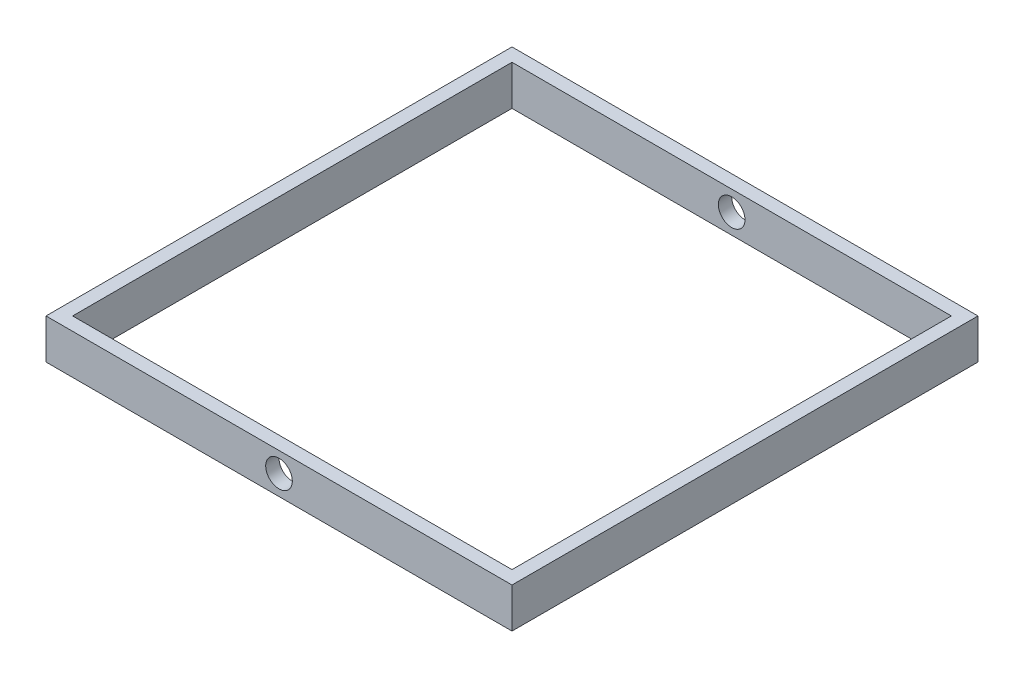
ISO-10303-21;
HEADER;
FILE_DESCRIPTION(('STEP AP214'),'2;1');
FILE_NAME('part.step','',(''),(''),'','','');
FILE_SCHEMA(('AUTOMOTIVE_DESIGN { 1 0 10303 214 1 1 1 1 }'));
ENDSEC;
DATA;
#1=APPLICATION_CONTEXT('core data for automotive mechanical design processes');
#2=APPLICATION_PROTOCOL_DEFINITION('international standard','automotive_design',2000,#1);
#3=PRODUCT_CONTEXT('',#1,'mechanical');
#4=PRODUCT('Part','Part','',(#3));
#5=PRODUCT_RELATED_PRODUCT_CATEGORY('part','',(#4));
#6=PRODUCT_DEFINITION_FORMATION('','',#4);
#7=PRODUCT_DEFINITION_CONTEXT('part definition',#1,'design');
#8=PRODUCT_DEFINITION('design','',#6,#7);
#9=PRODUCT_DEFINITION_SHAPE('','',#8);
#10=(LENGTH_UNIT() NAMED_UNIT(*) SI_UNIT(.MILLI.,.METRE.));
#11=(NAMED_UNIT(*) PLANE_ANGLE_UNIT() SI_UNIT($,.RADIAN.));
#12=(NAMED_UNIT(*) SI_UNIT($,.STERADIAN.) SOLID_ANGLE_UNIT());
#13=UNCERTAINTY_MEASURE_WITH_UNIT(LENGTH_MEASURE(1.E-05),#10,'distance_accuracy_value','');
#14=(GEOMETRIC_REPRESENTATION_CONTEXT(3) GLOBAL_UNCERTAINTY_ASSIGNED_CONTEXT((#13)) GLOBAL_UNIT_ASSIGNED_CONTEXT((#10,
#11,#12)) REPRESENTATION_CONTEXT('',''));
#15=CARTESIAN_POINT('',(0.,0.,0.));
#16=DIRECTION('',(0.,0.,1.));
#17=DIRECTION('',(1.,0.,0.));
#18=AXIS2_PLACEMENT_3D('',#15,#16,#17);
#19=CARTESIAN_POINT('',(87.5,15.,87.5));
#20=DIRECTION('',(-1.,0.,0.));
#21=DIRECTION('',(0.,0.,1.));
#22=AXIS2_PLACEMENT_3D('',#19,#20,#21);
#23=PLANE('',#22);
#24=DIRECTION('',(0.,0.,-1.));
#25=VECTOR('',#24,1.);
#26=CARTESIAN_POINT('',(87.5,0.,87.5));
#27=LINE('',#26,#25);
#28=CARTESIAN_POINT('',(87.5,0.,87.5));
#29=VERTEX_POINT('',#28);
#30=CARTESIAN_POINT('',(87.5,0.,-87.5));
#31=VERTEX_POINT('',#30);
#32=EDGE_CURVE('E155',#29,#31,#27,.T.);
#33=ORIENTED_EDGE('',*,*,#32,.T.);
#34=DIRECTION('',(0.,-1.,0.));
#35=VECTOR('',#34,1.);
#36=CARTESIAN_POINT('',(87.5,15.,-87.5));
#37=LINE('',#36,#35);
#38=CARTESIAN_POINT('',(87.5,15.,-87.5));
#39=VERTEX_POINT('',#38);
#40=EDGE_CURVE('E11',#39,#31,#37,.T.);
#41=ORIENTED_EDGE('',*,*,#40,.F.);
#42=DIRECTION('',(0.,0.,-1.));
#43=VECTOR('',#42,1.);
#44=CARTESIAN_POINT('',(87.5,15.,87.5));
#45=LINE('',#44,#43);
#46=CARTESIAN_POINT('',(87.5,15.,87.5));
#47=VERTEX_POINT('',#46);
#48=EDGE_CURVE('E161',#47,#39,#45,.T.);
#49=ORIENTED_EDGE('',*,*,#48,.F.);
#50=DIRECTION('',(0.,-1.,0.));
#51=VECTOR('',#50,1.);
#52=CARTESIAN_POINT('',(87.5,15.,87.5));
#53=LINE('',#52,#51);
#54=EDGE_CURVE('E175',#47,#29,#53,.T.);
#55=ORIENTED_EDGE('',*,*,#54,.T.);
#56=EDGE_LOOP('',(#33,#41,#49,#55));
#57=FACE_BOUND('',#56,.T.);
#58=ADVANCED_FACE('F43',(#57),#23,.F.);
#59=CARTESIAN_POINT('',(-87.5,15.,-87.5));
#60=DIRECTION('',(0.,0.,1.));
#61=DIRECTION('',(1.,0.,0.));
#62=AXIS2_PLACEMENT_3D('',#59,#60,#61);
#63=PLANE('',#62);
#64=CARTESIAN_POINT('',(0.,7.5,-87.5));
#65=DIRECTION('',(0.,0.,1.));
#66=DIRECTION('',(1.,0.,0.));
#67=AXIS2_PLACEMENT_3D('',#64,#65,#66);
#68=CIRCLE('',#67,5.);
#69=CARTESIAN_POINT('',(5.,7.5,-87.5));
#70=VERTEX_POINT('',#69);
#71=EDGE_CURVE('E261',#70,#70,#68,.T.);
#72=ORIENTED_EDGE('',*,*,#71,.T.);
#73=EDGE_LOOP('',(#72));
#74=FACE_BOUND('',#73,.T.);
#75=DIRECTION('',(-1.,0.,0.));
#76=VECTOR('',#75,1.);
#77=CARTESIAN_POINT('',(-87.5,0.,-87.5));
#78=LINE('',#77,#76);
#79=CARTESIAN_POINT('',(-87.5,0.,-87.5));
#80=VERTEX_POINT('',#79);
#81=EDGE_CURVE('E179',#31,#80,#78,.T.);
#82=ORIENTED_EDGE('',*,*,#81,.T.);
#83=DIRECTION('',(0.,-1.,0.));
#84=VECTOR('',#83,1.);
#85=CARTESIAN_POINT('',(-87.5,15.,-87.5));
#86=LINE('',#85,#84);
#87=CARTESIAN_POINT('',(-87.5,15.,-87.5));
#88=VERTEX_POINT('',#87);
#89=EDGE_CURVE('E52',#88,#80,#86,.T.);
#90=ORIENTED_EDGE('',*,*,#89,.F.);
#91=DIRECTION('',(-1.,0.,0.));
#92=VECTOR('',#91,1.);
#93=CARTESIAN_POINT('',(-87.5,15.,-87.5));
#94=LINE('',#93,#92);
#95=EDGE_CURVE('E165',#39,#88,#94,.T.);
#96=ORIENTED_EDGE('',*,*,#95,.F.);
#97=ORIENTED_EDGE('',*,*,#40,.T.);
#98=EDGE_LOOP('',(#82,#90,#96,#97));
#99=FACE_BOUND('',#98,.T.);
#100=ADVANCED_FACE('F214',(#74,#99),#63,.F.);
#101=CARTESIAN_POINT('',(-87.5,15.,87.5));
#102=DIRECTION('',(1.,0.,0.));
#103=DIRECTION('',(0.,0.,-1.));
#104=AXIS2_PLACEMENT_3D('',#101,#102,#103);
#105=PLANE('',#104);
#106=DIRECTION('',(0.,0.,1.));
#107=VECTOR('',#106,1.);
#108=CARTESIAN_POINT('',(-87.5,0.,87.5));
#109=LINE('',#108,#107);
#110=CARTESIAN_POINT('',(-87.5,0.,87.5));
#111=VERTEX_POINT('',#110);
#112=EDGE_CURVE('E182',#80,#111,#109,.T.);
#113=ORIENTED_EDGE('',*,*,#112,.T.);
#114=DIRECTION('',(0.,-1.,0.));
#115=VECTOR('',#114,1.);
#116=CARTESIAN_POINT('',(-87.5,15.,87.5));
#117=LINE('',#116,#115);
#118=CARTESIAN_POINT('',(-87.5,15.,87.5));
#119=VERTEX_POINT('',#118);
#120=EDGE_CURVE('E190',#119,#111,#117,.T.);
#121=ORIENTED_EDGE('',*,*,#120,.F.);
#122=DIRECTION('',(0.,0.,1.));
#123=VECTOR('',#122,1.);
#124=CARTESIAN_POINT('',(-87.5,15.,87.5));
#125=LINE('',#124,#123);
#126=EDGE_CURVE('E169',#88,#119,#125,.T.);
#127=ORIENTED_EDGE('',*,*,#126,.F.);
#128=ORIENTED_EDGE('',*,*,#89,.T.);
#129=EDGE_LOOP('',(#113,#121,#127,#128));
#130=FACE_BOUND('',#129,.T.);
#131=ADVANCED_FACE('F200',(#130),#105,.F.);
#132=CARTESIAN_POINT('',(-87.5,15.,87.5));
#133=DIRECTION('',(0.,0.,-1.));
#134=DIRECTION('',(-1.,0.,0.));
#135=AXIS2_PLACEMENT_3D('',#132,#133,#134);
#136=PLANE('',#135);
#137=CARTESIAN_POINT('',(0.,7.5,87.5));
#138=DIRECTION('',(0.,0.,1.));
#139=DIRECTION('',(1.,0.,0.));
#140=AXIS2_PLACEMENT_3D('',#137,#138,#139);
#141=CIRCLE('',#140,5.);
#142=CARTESIAN_POINT('',(5.,7.5,87.5));
#143=VERTEX_POINT('',#142);
#144=EDGE_CURVE('E255',#143,#143,#141,.T.);
#145=ORIENTED_EDGE('',*,*,#144,.F.);
#146=EDGE_LOOP('',(#145));
#147=FACE_BOUND('',#146,.T.);
#148=DIRECTION('',(1.,0.,0.));
#149=VECTOR('',#148,1.);
#150=CARTESIAN_POINT('',(-87.5,0.,87.5));
#151=LINE('',#150,#149);
#152=EDGE_CURVE('E166',#111,#29,#151,.T.);
#153=ORIENTED_EDGE('',*,*,#152,.T.);
#154=ORIENTED_EDGE('',*,*,#54,.F.);
#155=DIRECTION('',(1.,0.,0.));
#156=VECTOR('',#155,1.);
#157=CARTESIAN_POINT('',(-87.5,15.,87.5));
#158=LINE('',#157,#156);
#159=EDGE_CURVE('E172',#119,#47,#158,.T.);
#160=ORIENTED_EDGE('',*,*,#159,.F.);
#161=ORIENTED_EDGE('',*,*,#120,.T.);
#162=EDGE_LOOP('',(#153,#154,#160,#161));
#163=FACE_BOUND('',#162,.T.);
#164=ADVANCED_FACE('F207',(#147,#163),#136,.F.);
#165=CARTESIAN_POINT('',(0.,15.,0.));
#166=DIRECTION('',(0.,-1.,0.));
#167=DIRECTION('',(0.,0.,-1.));
#168=AXIS2_PLACEMENT_3D('',#165,#166,#167);
#169=PLANE('',#168);
#170=DIRECTION('',(-1.,0.,0.));
#171=VECTOR('',#170,1.);
#172=CARTESIAN_POINT('',(-82.5,15.,-82.5));
#173=LINE('',#172,#171);
#174=CARTESIAN_POINT('',(82.5,15.,-82.5));
#175=VERTEX_POINT('',#174);
#176=CARTESIAN_POINT('',(-82.5,15.,-82.5));
#177=VERTEX_POINT('',#176);
#178=EDGE_CURVE('E146',#175,#177,#173,.T.);
#179=ORIENTED_EDGE('',*,*,#178,.F.);
#180=DIRECTION('',(0.,0.,-1.));
#181=VECTOR('',#180,1.);
#182=CARTESIAN_POINT('',(82.5,15.,82.5));
#183=LINE('',#182,#181);
#184=CARTESIAN_POINT('',(82.5,15.,82.5));
#185=VERTEX_POINT('',#184);
#186=EDGE_CURVE('E59',#185,#175,#183,.T.);
#187=ORIENTED_EDGE('',*,*,#186,.F.);
#188=DIRECTION('',(1.,0.,0.));
#189=VECTOR('',#188,1.);
#190=CARTESIAN_POINT('',(-82.5,15.,82.5));
#191=LINE('',#190,#189);
#192=CARTESIAN_POINT('',(-82.5,15.,82.5));
#193=VERTEX_POINT('',#192);
#194=EDGE_CURVE('E130',#193,#185,#191,.T.);
#195=ORIENTED_EDGE('',*,*,#194,.F.);
#196=DIRECTION('',(0.,0.,1.));
#197=VECTOR('',#196,1.);
#198=CARTESIAN_POINT('',(-82.5,15.,82.5));
#199=LINE('',#198,#197);
#200=EDGE_CURVE('E134',#177,#193,#199,.T.);
#201=ORIENTED_EDGE('',*,*,#200,.F.);
#202=EDGE_LOOP('',(#179,#187,#195,#201));
#203=FACE_BOUND('',#202,.T.);
#204=ORIENTED_EDGE('',*,*,#48,.T.);
#205=ORIENTED_EDGE('',*,*,#95,.T.);
#206=ORIENTED_EDGE('',*,*,#126,.T.);
#207=ORIENTED_EDGE('',*,*,#159,.T.);
#208=EDGE_LOOP('',(#204,#205,#206,#207));
#209=FACE_BOUND('',#208,.T.);
#210=ADVANCED_FACE('F213',(#203,#209),#169,.F.);
#211=CARTESIAN_POINT('',(0.,0.,0.));
#212=DIRECTION('',(0.,-1.,0.));
#213=DIRECTION('',(0.,0.,-1.));
#214=AXIS2_PLACEMENT_3D('',#211,#212,#213);
#215=PLANE('',#214);
#216=DIRECTION('',(0.,0.,-1.));
#217=VECTOR('',#216,1.);
#218=CARTESIAN_POINT('',(82.5,0.,82.5));
#219=LINE('',#218,#217);
#220=CARTESIAN_POINT('',(82.5,0.,82.5));
#221=VERTEX_POINT('',#220);
#222=CARTESIAN_POINT('',(82.5,0.,-82.5));
#223=VERTEX_POINT('',#222);
#224=EDGE_CURVE('E111',#221,#223,#219,.T.);
#225=ORIENTED_EDGE('',*,*,#224,.T.);
#226=DIRECTION('',(-1.,0.,0.));
#227=VECTOR('',#226,1.);
#228=CARTESIAN_POINT('',(-82.5,0.,-82.5));
#229=LINE('',#228,#227);
#230=CARTESIAN_POINT('',(-82.5,0.,-82.5));
#231=VERTEX_POINT('',#230);
#232=EDGE_CURVE('E121',#223,#231,#229,.T.);
#233=ORIENTED_EDGE('',*,*,#232,.T.);
#234=DIRECTION('',(0.,0.,1.));
#235=VECTOR('',#234,1.);
#236=CARTESIAN_POINT('',(-82.5,0.,82.5));
#237=LINE('',#236,#235);
#238=CARTESIAN_POINT('',(-82.5,0.,82.5));
#239=VERTEX_POINT('',#238);
#240=EDGE_CURVE('E67',#231,#239,#237,.T.);
#241=ORIENTED_EDGE('',*,*,#240,.T.);
#242=DIRECTION('',(1.,0.,0.));
#243=VECTOR('',#242,1.);
#244=CARTESIAN_POINT('',(-82.5,0.,82.5));
#245=LINE('',#244,#243);
#246=EDGE_CURVE('E118',#239,#221,#245,.T.);
#247=ORIENTED_EDGE('',*,*,#246,.T.);
#248=EDGE_LOOP('',(#225,#233,#241,#247));
#249=FACE_BOUND('',#248,.T.);
#250=ORIENTED_EDGE('',*,*,#32,.F.);
#251=ORIENTED_EDGE('',*,*,#152,.F.);
#252=ORIENTED_EDGE('',*,*,#112,.F.);
#253=ORIENTED_EDGE('',*,*,#81,.F.);
#254=EDGE_LOOP('',(#250,#251,#252,#253));
#255=FACE_BOUND('',#254,.T.);
#256=ADVANCED_FACE('F126',(#249,#255),#215,.T.);
#257=CARTESIAN_POINT('',(82.5,0.,82.5));
#258=DIRECTION('',(1.,0.,0.));
#259=DIRECTION('',(0.,0.,-1.));
#260=AXIS2_PLACEMENT_3D('',#257,#258,#259);
#261=PLANE('',#260);
#262=ORIENTED_EDGE('',*,*,#186,.T.);
#263=DIRECTION('',(0.,1.,0.));
#264=VECTOR('',#263,1.);
#265=CARTESIAN_POINT('',(82.5,0.,-82.5));
#266=LINE('',#265,#264);
#267=EDGE_CURVE('E107',#223,#175,#266,.T.);
#268=ORIENTED_EDGE('',*,*,#267,.F.);
#269=ORIENTED_EDGE('',*,*,#224,.F.);
#270=DIRECTION('',(0.,1.,0.));
#271=VECTOR('',#270,1.);
#272=CARTESIAN_POINT('',(82.5,0.,82.5));
#273=LINE('',#272,#271);
#274=EDGE_CURVE('E152',#221,#185,#273,.T.);
#275=ORIENTED_EDGE('',*,*,#274,.T.);
#276=EDGE_LOOP('',(#262,#268,#269,#275));
#277=FACE_BOUND('',#276,.T.);
#278=ADVANCED_FACE('F109',(#277),#261,.F.);
#279=CARTESIAN_POINT('',(-82.5,0.,82.5));
#280=DIRECTION('',(0.,0.,1.));
#281=DIRECTION('',(1.,0.,0.));
#282=AXIS2_PLACEMENT_3D('',#279,#280,#281);
#283=PLANE('',#282);
#284=CARTESIAN_POINT('',(0.,7.5,82.5));
#285=DIRECTION('',(0.,0.,1.));
#286=DIRECTION('',(1.,0.,0.));
#287=AXIS2_PLACEMENT_3D('',#284,#285,#286);
#288=CIRCLE('',#287,5.);
#289=CARTESIAN_POINT('',(5.,7.5,82.5));
#290=VERTEX_POINT('',#289);
#291=EDGE_CURVE('E137',#290,#290,#288,.T.);
#292=ORIENTED_EDGE('',*,*,#291,.T.);
#293=EDGE_LOOP('',(#292));
#294=FACE_BOUND('',#293,.T.);
#295=ORIENTED_EDGE('',*,*,#194,.T.);
#296=ORIENTED_EDGE('',*,*,#274,.F.);
#297=ORIENTED_EDGE('',*,*,#246,.F.);
#298=DIRECTION('',(0.,1.,0.));
#299=VECTOR('',#298,1.);
#300=CARTESIAN_POINT('',(-82.5,0.,82.5));
#301=LINE('',#300,#299);
#302=EDGE_CURVE('E156',#239,#193,#301,.T.);
#303=ORIENTED_EDGE('',*,*,#302,.T.);
#304=EDGE_LOOP('',(#295,#296,#297,#303));
#305=FACE_BOUND('',#304,.T.);
#306=ADVANCED_FACE('F234',(#294,#305),#283,.F.);
#307=CARTESIAN_POINT('',(-82.5,0.,82.5));
#308=DIRECTION('',(-1.,0.,0.));
#309=DIRECTION('',(0.,0.,1.));
#310=AXIS2_PLACEMENT_3D('',#307,#308,#309);
#311=PLANE('',#310);
#312=ORIENTED_EDGE('',*,*,#200,.T.);
#313=ORIENTED_EDGE('',*,*,#302,.F.);
#314=ORIENTED_EDGE('',*,*,#240,.F.);
#315=DIRECTION('',(0.,1.,0.));
#316=VECTOR('',#315,1.);
#317=CARTESIAN_POINT('',(-82.5,0.,-82.5));
#318=LINE('',#317,#316);
#319=EDGE_CURVE('E117',#231,#177,#318,.T.);
#320=ORIENTED_EDGE('',*,*,#319,.T.);
#321=EDGE_LOOP('',(#312,#313,#314,#320));
#322=FACE_BOUND('',#321,.T.);
#323=ADVANCED_FACE('F238',(#322),#311,.F.);
#324=CARTESIAN_POINT('',(-82.5,0.,-82.5));
#325=DIRECTION('',(0.,0.,-1.));
#326=DIRECTION('',(-1.,0.,0.));
#327=AXIS2_PLACEMENT_3D('',#324,#325,#326);
#328=PLANE('',#327);
#329=CARTESIAN_POINT('',(0.,7.5,-82.5));
#330=DIRECTION('',(0.,0.,-1.));
#331=DIRECTION('',(-1.,0.,0.));
#332=AXIS2_PLACEMENT_3D('',#329,#330,#331);
#333=CIRCLE('',#332,5.);
#334=CARTESIAN_POINT('',(-5.,7.5,-82.5));
#335=VERTEX_POINT('',#334);
#336=EDGE_CURVE('E46',#335,#335,#333,.T.);
#337=ORIENTED_EDGE('',*,*,#336,.T.);
#338=EDGE_LOOP('',(#337));
#339=FACE_BOUND('',#338,.T.);
#340=ORIENTED_EDGE('',*,*,#178,.T.);
#341=ORIENTED_EDGE('',*,*,#319,.F.);
#342=ORIENTED_EDGE('',*,*,#232,.F.);
#343=ORIENTED_EDGE('',*,*,#267,.T.);
#344=EDGE_LOOP('',(#340,#341,#342,#343));
#345=FACE_BOUND('',#344,.T.);
#346=ADVANCED_FACE('F122',(#339,#345),#328,.F.);
#347=CARTESIAN_POINT('',(0.,7.5,-87.5));
#348=DIRECTION('',(0.,0.,1.));
#349=DIRECTION('',(1.,0.,0.));
#350=AXIS2_PLACEMENT_3D('',#347,#348,#349);
#351=CYLINDRICAL_SURFACE('',#350,5.);
#352=ORIENTED_EDGE('',*,*,#71,.F.);
#353=EDGE_LOOP('',(#352));
#354=FACE_BOUND('',#353,.T.);
#355=ORIENTED_EDGE('',*,*,#336,.F.);
#356=EDGE_LOOP('',(#355));
#357=FACE_BOUND('',#356,.T.);
#358=ADVANCED_FACE('F237',(#354,#357),#351,.F.);
#359=ORIENTED_EDGE('',*,*,#144,.T.);
#360=EDGE_LOOP('',(#359));
#361=FACE_BOUND('',#360,.T.);
#362=ORIENTED_EDGE('',*,*,#291,.F.);
#363=EDGE_LOOP('',(#362));
#364=FACE_BOUND('',#363,.T.);
#365=ADVANCED_FACE('F245',(#361,#364),#351,.F.);
#366=CLOSED_SHELL('',(#58,#100,#131,#164,#210,#256,#278,#306,#323,#346,#358,#365));
#367=MANIFOLD_SOLID_BREP('B2',#366);
#368=ADVANCED_BREP_SHAPE_REPRESENTATION('',(#18,#367),#14);
#369=SHAPE_DEFINITION_REPRESENTATION(#9,#368);
ENDSEC;
END-ISO-10303-21;
